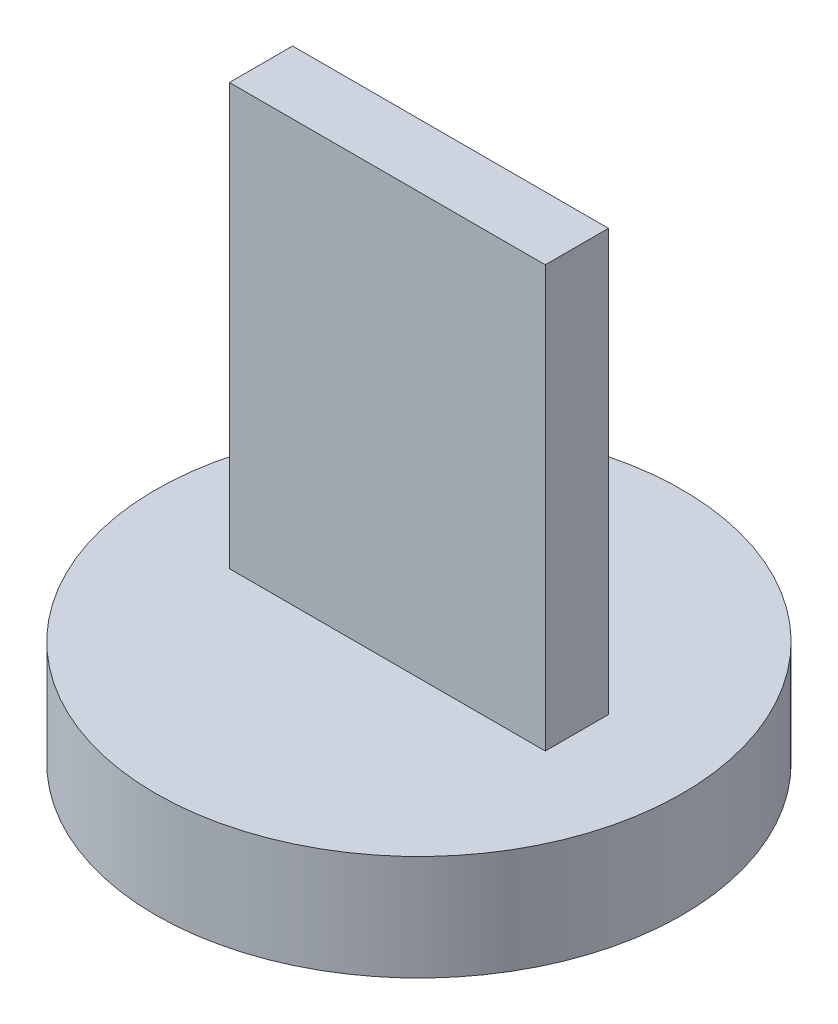
ISO-10303-21;
HEADER;
FILE_DESCRIPTION(('STEP AP214'),'2;1');
FILE_NAME('part.step','',(''),(''),'','','');
FILE_SCHEMA(('AUTOMOTIVE_DESIGN { 1 0 10303 214 1 1 1 1 }'));
ENDSEC;
DATA;
#1=APPLICATION_CONTEXT('core data for automotive mechanical design processes');
#2=APPLICATION_PROTOCOL_DEFINITION('international standard','automotive_design',2000,#1);
#3=PRODUCT_CONTEXT('',#1,'mechanical');
#4=PRODUCT('Part','Part','',(#3));
#5=PRODUCT_RELATED_PRODUCT_CATEGORY('part','',(#4));
#6=PRODUCT_DEFINITION_FORMATION('','',#4);
#7=PRODUCT_DEFINITION_CONTEXT('part definition',#1,'design');
#8=PRODUCT_DEFINITION('design','',#6,#7);
#9=PRODUCT_DEFINITION_SHAPE('','',#8);
#10=(LENGTH_UNIT() NAMED_UNIT(*) SI_UNIT(.MILLI.,.METRE.));
#11=(NAMED_UNIT(*) PLANE_ANGLE_UNIT() SI_UNIT($,.RADIAN.));
#12=(NAMED_UNIT(*) SI_UNIT($,.STERADIAN.) SOLID_ANGLE_UNIT());
#13=UNCERTAINTY_MEASURE_WITH_UNIT(LENGTH_MEASURE(1.E-05),#10,'distance_accuracy_value','');
#14=(GEOMETRIC_REPRESENTATION_CONTEXT(3) GLOBAL_UNCERTAINTY_ASSIGNED_CONTEXT((#13)) GLOBAL_UNIT_ASSIGNED_CONTEXT((#10,
#11,#12)) REPRESENTATION_CONTEXT('',''));
#15=CARTESIAN_POINT('',(0.,0.,0.));
#16=DIRECTION('',(0.,0.,1.));
#17=DIRECTION('',(1.,0.,0.));
#18=AXIS2_PLACEMENT_3D('',#15,#16,#17);
#19=CARTESIAN_POINT('',(0.,1.,0.));
#20=DIRECTION('',(0.,1.,0.));
#21=DIRECTION('',(0.,0.,1.));
#22=AXIS2_PLACEMENT_3D('',#19,#20,#21);
#23=PLANE('',#22);
#24=CARTESIAN_POINT('',(0.,1.,0.));
#25=DIRECTION('',(0.,1.,0.));
#26=DIRECTION('',(0.,0.,1.));
#27=AXIS2_PLACEMENT_3D('',#24,#25,#26);
#28=CIRCLE('',#27,2.5);
#29=CARTESIAN_POINT('',(0.,1.,2.5));
#30=VERTEX_POINT('',#29);
#31=EDGE_CURVE('E11',#30,#30,#28,.T.);
#32=ORIENTED_EDGE('',*,*,#31,.T.);
#33=EDGE_LOOP('',(#32));
#34=FACE_BOUND('',#33,.T.);
#35=DIRECTION('',(0.,0.,1.));
#36=VECTOR('',#35,1.);
#37=CARTESIAN_POINT('',(-1.5,1.,-0.3));
#38=LINE('',#37,#36);
#39=CARTESIAN_POINT('',(-1.5,1.,-0.3));
#40=VERTEX_POINT('',#39);
#41=CARTESIAN_POINT('',(-1.5,1.,0.3));
#42=VERTEX_POINT('',#41);
#43=EDGE_CURVE('E91',#40,#42,#38,.T.);
#44=ORIENTED_EDGE('',*,*,#43,.F.);
#45=DIRECTION('',(-1.,0.,0.));
#46=VECTOR('',#45,1.);
#47=CARTESIAN_POINT('',(1.5,1.,-0.3));
#48=LINE('',#47,#46);
#49=CARTESIAN_POINT('',(1.5,1.,-0.3));
#50=VERTEX_POINT('',#49);
#51=EDGE_CURVE('E102',#50,#40,#48,.T.);
#52=ORIENTED_EDGE('',*,*,#51,.F.);
#53=DIRECTION('',(0.,0.,-1.));
#54=VECTOR('',#53,1.);
#55=CARTESIAN_POINT('',(1.5,1.,-0.3));
#56=LINE('',#55,#54);
#57=CARTESIAN_POINT('',(1.5,1.,0.3));
#58=VERTEX_POINT('',#57);
#59=EDGE_CURVE('E72',#58,#50,#56,.T.);
#60=ORIENTED_EDGE('',*,*,#59,.F.);
#61=DIRECTION('',(1.,0.,0.));
#62=VECTOR('',#61,1.);
#63=CARTESIAN_POINT('',(1.5,1.,0.3));
#64=LINE('',#63,#62);
#65=EDGE_CURVE('E106',#42,#58,#64,.T.);
#66=ORIENTED_EDGE('',*,*,#65,.F.);
#67=EDGE_LOOP('',(#44,#52,#60,#66));
#68=FACE_BOUND('',#67,.T.);
#69=ADVANCED_FACE('F35',(#34,#68),#23,.T.);
#70=CARTESIAN_POINT('',(0.,1.,0.));
#71=DIRECTION('',(0.,-1.,0.));
#72=DIRECTION('',(0.,0.,-1.));
#73=AXIS2_PLACEMENT_3D('',#70,#71,#72);
#74=CYLINDRICAL_SURFACE('',#73,2.5);
#75=ORIENTED_EDGE('',*,*,#31,.F.);
#76=EDGE_LOOP('',(#75));
#77=FACE_BOUND('',#76,.T.);
#78=CARTESIAN_POINT('',(0.,0.,0.));
#79=DIRECTION('',(0.,1.,0.));
#80=DIRECTION('',(0.,0.,1.));
#81=AXIS2_PLACEMENT_3D('',#78,#79,#80);
#82=CIRCLE('',#81,2.5);
#83=CARTESIAN_POINT('',(0.,0.,2.5));
#84=VERTEX_POINT('',#83);
#85=EDGE_CURVE('E39',#84,#84,#82,.T.);
#86=ORIENTED_EDGE('',*,*,#85,.T.);
#87=EDGE_LOOP('',(#86));
#88=FACE_BOUND('',#87,.T.);
#89=ADVANCED_FACE('F37',(#77,#88),#74,.T.);
#90=CARTESIAN_POINT('',(0.,0.,0.));
#91=DIRECTION('',(0.,1.,0.));
#92=DIRECTION('',(0.,0.,1.));
#93=AXIS2_PLACEMENT_3D('',#90,#91,#92);
#94=PLANE('',#93);
#95=ORIENTED_EDGE('',*,*,#85,.F.);
#96=EDGE_LOOP('',(#95));
#97=FACE_BOUND('',#96,.T.);
#98=ADVANCED_FACE('F115',(#97),#94,.F.);
#99=CARTESIAN_POINT('',(1.5,5.,-0.3));
#100=DIRECTION('',(0.,0.,1.));
#101=DIRECTION('',(1.,0.,0.));
#102=AXIS2_PLACEMENT_3D('',#99,#100,#101);
#103=PLANE('',#102);
#104=ORIENTED_EDGE('',*,*,#51,.T.);
#105=DIRECTION('',(0.,-1.,0.));
#106=VECTOR('',#105,1.);
#107=CARTESIAN_POINT('',(-1.5,5.,-0.3));
#108=LINE('',#107,#106);
#109=CARTESIAN_POINT('',(-1.5,5.,-0.3));
#110=VERTEX_POINT('',#109);
#111=EDGE_CURVE('E94',#110,#40,#108,.T.);
#112=ORIENTED_EDGE('',*,*,#111,.F.);
#113=DIRECTION('',(-1.,0.,0.));
#114=VECTOR('',#113,1.);
#115=CARTESIAN_POINT('',(1.5,5.,-0.3));
#116=LINE('',#115,#114);
#117=CARTESIAN_POINT('',(1.5,5.,-0.3));
#118=VERTEX_POINT('',#117);
#119=EDGE_CURVE('E84',#118,#110,#116,.T.);
#120=ORIENTED_EDGE('',*,*,#119,.F.);
#121=DIRECTION('',(0.,-1.,0.));
#122=VECTOR('',#121,1.);
#123=CARTESIAN_POINT('',(1.5,5.,-0.3));
#124=LINE('',#123,#122);
#125=EDGE_CURVE('E98',#118,#50,#124,.T.);
#126=ORIENTED_EDGE('',*,*,#125,.T.);
#127=EDGE_LOOP('',(#104,#112,#120,#126));
#128=FACE_BOUND('',#127,.T.);
#129=ADVANCED_FACE('F117',(#128),#103,.F.);
#130=CARTESIAN_POINT('',(-1.5,5.,-0.3));
#131=DIRECTION('',(1.,0.,0.));
#132=DIRECTION('',(0.,0.,-1.));
#133=AXIS2_PLACEMENT_3D('',#130,#131,#132);
#134=PLANE('',#133);
#135=ORIENTED_EDGE('',*,*,#43,.T.);
#136=DIRECTION('',(0.,-1.,0.));
#137=VECTOR('',#136,1.);
#138=CARTESIAN_POINT('',(-1.5,5.,0.3));
#139=LINE('',#138,#137);
#140=CARTESIAN_POINT('',(-1.5,5.,0.3));
#141=VERTEX_POINT('',#140);
#142=EDGE_CURVE('E88',#141,#42,#139,.T.);
#143=ORIENTED_EDGE('',*,*,#142,.F.);
#144=DIRECTION('',(0.,0.,1.));
#145=VECTOR('',#144,1.);
#146=CARTESIAN_POINT('',(-1.5,5.,-0.3));
#147=LINE('',#146,#145);
#148=EDGE_CURVE('E79',#110,#141,#147,.T.);
#149=ORIENTED_EDGE('',*,*,#148,.F.);
#150=ORIENTED_EDGE('',*,*,#111,.T.);
#151=EDGE_LOOP('',(#135,#143,#149,#150));
#152=FACE_BOUND('',#151,.T.);
#153=ADVANCED_FACE('F89',(#152),#134,.F.);
#154=CARTESIAN_POINT('',(1.5,5.,0.3));
#155=DIRECTION('',(0.,0.,-1.));
#156=DIRECTION('',(-1.,0.,0.));
#157=AXIS2_PLACEMENT_3D('',#154,#155,#156);
#158=PLANE('',#157);
#159=ORIENTED_EDGE('',*,*,#65,.T.);
#160=DIRECTION('',(0.,-1.,0.));
#161=VECTOR('',#160,1.);
#162=CARTESIAN_POINT('',(1.5,5.,0.3));
#163=LINE('',#162,#161);
#164=CARTESIAN_POINT('',(1.5,5.,0.3));
#165=VERTEX_POINT('',#164);
#166=EDGE_CURVE('E50',#165,#58,#163,.T.);
#167=ORIENTED_EDGE('',*,*,#166,.F.);
#168=DIRECTION('',(1.,0.,0.));
#169=VECTOR('',#168,1.);
#170=CARTESIAN_POINT('',(1.5,5.,0.3));
#171=LINE('',#170,#169);
#172=EDGE_CURVE('E82',#141,#165,#171,.T.);
#173=ORIENTED_EDGE('',*,*,#172,.F.);
#174=ORIENTED_EDGE('',*,*,#142,.T.);
#175=EDGE_LOOP('',(#159,#167,#173,#174));
#176=FACE_BOUND('',#175,.T.);
#177=ADVANCED_FACE('F96',(#176),#158,.F.);
#178=CARTESIAN_POINT('',(1.5,5.,-0.3));
#179=DIRECTION('',(-1.,0.,0.));
#180=DIRECTION('',(0.,0.,1.));
#181=AXIS2_PLACEMENT_3D('',#178,#179,#180);
#182=PLANE('',#181);
#183=ORIENTED_EDGE('',*,*,#59,.T.);
#184=ORIENTED_EDGE('',*,*,#125,.F.);
#185=DIRECTION('',(0.,0.,-1.));
#186=VECTOR('',#185,1.);
#187=CARTESIAN_POINT('',(1.5,5.,-0.3));
#188=LINE('',#187,#186);
#189=EDGE_CURVE('E58',#165,#118,#188,.T.);
#190=ORIENTED_EDGE('',*,*,#189,.F.);
#191=ORIENTED_EDGE('',*,*,#166,.T.);
#192=EDGE_LOOP('',(#183,#184,#190,#191));
#193=FACE_BOUND('',#192,.T.);
#194=ADVANCED_FACE('F136',(#193),#182,.F.);
#195=CARTESIAN_POINT('',(0.,5.,0.));
#196=DIRECTION('',(0.,1.,0.));
#197=DIRECTION('',(0.,0.,1.));
#198=AXIS2_PLACEMENT_3D('',#195,#196,#197);
#199=PLANE('',#198);
#200=ORIENTED_EDGE('',*,*,#119,.T.);
#201=ORIENTED_EDGE('',*,*,#148,.T.);
#202=ORIENTED_EDGE('',*,*,#172,.T.);
#203=ORIENTED_EDGE('',*,*,#189,.T.);
#204=EDGE_LOOP('',(#200,#201,#202,#203));
#205=FACE_BOUND('',#204,.T.);
#206=ADVANCED_FACE('F80',(#205),#199,.T.);
#207=CLOSED_SHELL('',(#69,#89,#98,#129,#153,#177,#194,#206));
#208=MANIFOLD_SOLID_BREP('B2',#207);
#209=ADVANCED_BREP_SHAPE_REPRESENTATION('',(#18,#208),#14);
#210=SHAPE_DEFINITION_REPRESENTATION(#9,#209);
ENDSEC;
END-ISO-10303-21;
